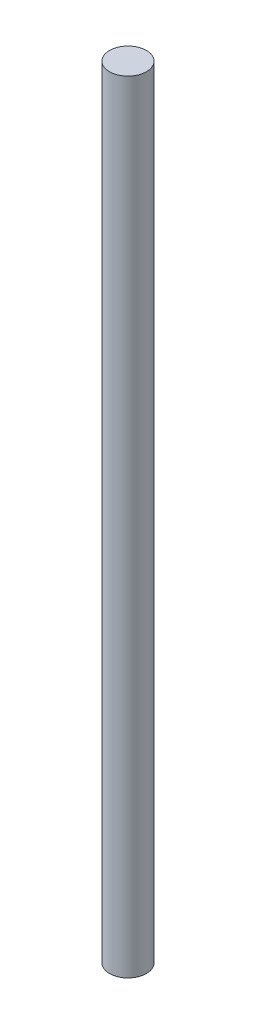
ISO-10303-21;
HEADER;
FILE_DESCRIPTION(('STEP AP214'),'2;1');
FILE_NAME('part.step','',(''),(''),'','','');
FILE_SCHEMA(('AUTOMOTIVE_DESIGN { 1 0 10303 214 1 1 1 1 }'));
ENDSEC;
DATA;
#1=APPLICATION_CONTEXT('core data for automotive mechanical design processes');
#2=APPLICATION_PROTOCOL_DEFINITION('international standard','automotive_design',2000,#1);
#3=PRODUCT_CONTEXT('',#1,'mechanical');
#4=PRODUCT('Part','Part','',(#3));
#5=PRODUCT_RELATED_PRODUCT_CATEGORY('part','',(#4));
#6=PRODUCT_DEFINITION_FORMATION('','',#4);
#7=PRODUCT_DEFINITION_CONTEXT('part definition',#1,'design');
#8=PRODUCT_DEFINITION('design','',#6,#7);
#9=PRODUCT_DEFINITION_SHAPE('','',#8);
#10=(LENGTH_UNIT() NAMED_UNIT(*) SI_UNIT(.MILLI.,.METRE.));
#11=(NAMED_UNIT(*) PLANE_ANGLE_UNIT() SI_UNIT($,.RADIAN.));
#12=(NAMED_UNIT(*) SI_UNIT($,.STERADIAN.) SOLID_ANGLE_UNIT());
#13=UNCERTAINTY_MEASURE_WITH_UNIT(LENGTH_MEASURE(1.E-05),#10,'distance_accuracy_value','');
#14=(GEOMETRIC_REPRESENTATION_CONTEXT(3) GLOBAL_UNCERTAINTY_ASSIGNED_CONTEXT((#13)) GLOBAL_UNIT_ASSIGNED_CONTEXT((#10,
#11,#12)) REPRESENTATION_CONTEXT('',''));
#15=CARTESIAN_POINT('',(0.,0.,0.));
#16=DIRECTION('',(0.,0.,1.));
#17=DIRECTION('',(1.,0.,0.));
#18=AXIS2_PLACEMENT_3D('',#15,#16,#17);
#19=CARTESIAN_POINT('',(0.,254.,0.));
#20=DIRECTION('',(0.,-1.,0.));
#21=DIRECTION('',(0.,0.,-1.));
#22=AXIS2_PLACEMENT_3D('',#19,#20,#21);
#23=CYLINDRICAL_SURFACE('',#22,6.);
#24=CARTESIAN_POINT('',(0.,254.,0.));
#25=DIRECTION('',(0.,1.,0.));
#26=DIRECTION('',(0.,0.,1.));
#27=AXIS2_PLACEMENT_3D('',#24,#25,#26);
#28=CIRCLE('',#27,6.);
#29=CARTESIAN_POINT('',(0.,254.,6.));
#30=VERTEX_POINT('',#29);
#31=EDGE_CURVE('E10',#30,#30,#28,.T.);
#32=ORIENTED_EDGE('',*,*,#31,.F.);
#33=EDGE_LOOP('',(#32));
#34=FACE_BOUND('',#33,.T.);
#35=CARTESIAN_POINT('',(0.,0.,0.));
#36=DIRECTION('',(0.,1.,0.));
#37=DIRECTION('',(0.,0.,1.));
#38=AXIS2_PLACEMENT_3D('',#35,#36,#37);
#39=CIRCLE('',#38,6.);
#40=CARTESIAN_POINT('',(0.,0.,6.));
#41=VERTEX_POINT('',#40);
#42=EDGE_CURVE('E43',#41,#41,#39,.T.);
#43=ORIENTED_EDGE('',*,*,#42,.T.);
#44=EDGE_LOOP('',(#43));
#45=FACE_BOUND('',#44,.T.);
#46=ADVANCED_FACE('F40',(#34,#45),#23,.T.);
#47=CARTESIAN_POINT('',(0.,254.,0.));
#48=DIRECTION('',(0.,1.,0.));
#49=DIRECTION('',(0.,0.,1.));
#50=AXIS2_PLACEMENT_3D('',#47,#48,#49);
#51=PLANE('',#50);
#52=ORIENTED_EDGE('',*,*,#31,.T.);
#53=EDGE_LOOP('',(#52));
#54=FACE_BOUND('',#53,.T.);
#55=ADVANCED_FACE('F57',(#54),#51,.T.);
#56=CARTESIAN_POINT('',(0.,0.,0.));
#57=DIRECTION('',(0.,1.,0.));
#58=DIRECTION('',(0.,0.,1.));
#59=AXIS2_PLACEMENT_3D('',#56,#57,#58);
#60=PLANE('',#59);
#61=ORIENTED_EDGE('',*,*,#42,.F.);
#62=EDGE_LOOP('',(#61));
#63=FACE_BOUND('',#62,.T.);
#64=ADVANCED_FACE('F55',(#63),#60,.F.);
#65=CLOSED_SHELL('',(#46,#55,#64));
#66=MANIFOLD_SOLID_BREP('B2',#65);
#67=ADVANCED_BREP_SHAPE_REPRESENTATION('',(#18,#66),#14);
#68=SHAPE_DEFINITION_REPRESENTATION(#9,#67);
ENDSEC;
END-ISO-10303-21;
